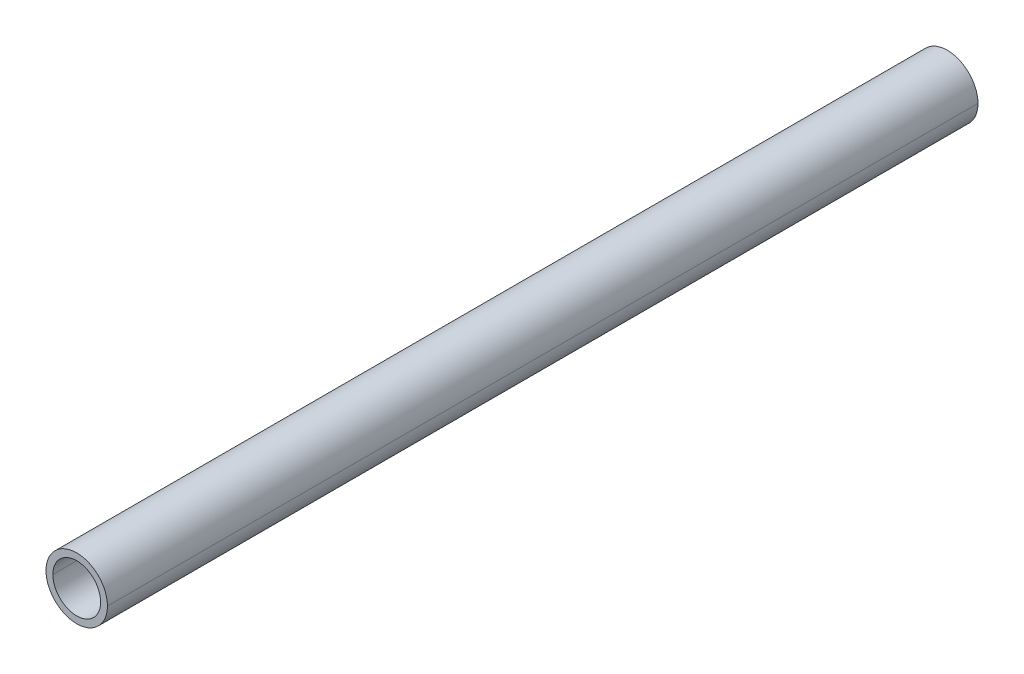
ISO-10303-21;
HEADER;
FILE_DESCRIPTION(('STEP AP214'),'2;1');
FILE_NAME('part.step','',(''),(''),'','','');
FILE_SCHEMA(('AUTOMOTIVE_DESIGN { 1 0 10303 214 1 1 1 1 }'));
ENDSEC;
DATA;
#1=APPLICATION_CONTEXT('core data for automotive mechanical design processes');
#2=APPLICATION_PROTOCOL_DEFINITION('international standard','automotive_design',2000,#1);
#3=PRODUCT_CONTEXT('',#1,'mechanical');
#4=PRODUCT('Part','Part','',(#3));
#5=PRODUCT_RELATED_PRODUCT_CATEGORY('part','',(#4));
#6=PRODUCT_DEFINITION_FORMATION('','',#4);
#7=PRODUCT_DEFINITION_CONTEXT('part definition',#1,'design');
#8=PRODUCT_DEFINITION('design','',#6,#7);
#9=PRODUCT_DEFINITION_SHAPE('','',#8);
#10=(LENGTH_UNIT() NAMED_UNIT(*) SI_UNIT(.MILLI.,.METRE.));
#11=(NAMED_UNIT(*) PLANE_ANGLE_UNIT() SI_UNIT($,.RADIAN.));
#12=(NAMED_UNIT(*) SI_UNIT($,.STERADIAN.) SOLID_ANGLE_UNIT());
#13=UNCERTAINTY_MEASURE_WITH_UNIT(LENGTH_MEASURE(1.E-05),#10,'distance_accuracy_value','');
#14=(GEOMETRIC_REPRESENTATION_CONTEXT(3) GLOBAL_UNCERTAINTY_ASSIGNED_CONTEXT((#13)) GLOBAL_UNIT_ASSIGNED_CONTEXT((#10,
#11,#12)) REPRESENTATION_CONTEXT('',''));
#15=CARTESIAN_POINT('',(0.,0.,0.));
#16=DIRECTION('',(0.,0.,1.));
#17=DIRECTION('',(1.,0.,0.));
#18=AXIS2_PLACEMENT_3D('',#15,#16,#17);
#19=CARTESIAN_POINT('',(0.,0.,255.08));
#20=DIRECTION('',(0.,0.,-1.));
#21=DIRECTION('',(-1.,0.,0.));
#22=AXIS2_PLACEMENT_3D('',#19,#20,#21);
#23=CYLINDRICAL_SURFACE('',#22,7.);
#24=DIRECTION('',(0.,0.,-1.));
#25=VECTOR('',#24,1.);
#26=CARTESIAN_POINT('',(7.,0.,255.08));
#27=LINE('',#26,#25);
#28=CARTESIAN_POINT('',(7.,0.,255.08));
#29=VERTEX_POINT('',#28);
#30=CARTESIAN_POINT('',(7.,0.,0.));
#31=VERTEX_POINT('',#30);
#32=EDGE_CURVE('E83',#29,#31,#27,.T.);
#33=ORIENTED_EDGE('',*,*,#32,.F.);
#34=CARTESIAN_POINT('',(0.,0.,255.08));
#35=DIRECTION('',(0.,0.,1.));
#36=DIRECTION('',(1.,0.,0.));
#37=AXIS2_PLACEMENT_3D('',#34,#35,#36);
#38=CIRCLE('',#37,7.);
#39=CARTESIAN_POINT('',(-7.,0.,255.08));
#40=VERTEX_POINT('',#39);
#41=EDGE_CURVE('E75',#29,#40,#38,.T.);
#42=ORIENTED_EDGE('',*,*,#41,.T.);
#43=DIRECTION('',(0.,0.,-1.));
#44=VECTOR('',#43,1.);
#45=CARTESIAN_POINT('',(-7.,0.,255.08));
#46=LINE('',#45,#44);
#47=CARTESIAN_POINT('',(-7.,0.,0.));
#48=VERTEX_POINT('',#47);
#49=EDGE_CURVE('E73',#40,#48,#46,.T.);
#50=ORIENTED_EDGE('',*,*,#49,.T.);
#51=CARTESIAN_POINT('',(0.,0.,0.));
#52=DIRECTION('',(0.,0.,1.));
#53=DIRECTION('',(1.,0.,0.));
#54=AXIS2_PLACEMENT_3D('',#51,#52,#53);
#55=CIRCLE('',#54,7.);
#56=EDGE_CURVE('E11',#31,#48,#55,.T.);
#57=ORIENTED_EDGE('',*,*,#56,.F.);
#58=EDGE_LOOP('',(#33,#42,#50,#57));
#59=FACE_BOUND('',#58,.T.);
#60=ADVANCED_FACE('F16',(#59),#23,.F.);
#61=CARTESIAN_POINT('',(0.,0.,255.08));
#62=DIRECTION('',(0.,0.,-1.));
#63=DIRECTION('',(-1.,0.,0.));
#64=AXIS2_PLACEMENT_3D('',#61,#62,#63);
#65=CYLINDRICAL_SURFACE('',#64,9.);
#66=DIRECTION('',(0.,0.,-1.));
#67=VECTOR('',#66,1.);
#68=CARTESIAN_POINT('',(9.,0.,255.08));
#69=LINE('',#68,#67);
#70=CARTESIAN_POINT('',(9.,0.,255.08));
#71=VERTEX_POINT('',#70);
#72=CARTESIAN_POINT('',(9.,0.,0.));
#73=VERTEX_POINT('',#72);
#74=EDGE_CURVE('E105',#71,#73,#69,.T.);
#75=ORIENTED_EDGE('',*,*,#74,.F.);
#76=CARTESIAN_POINT('',(0.,0.,255.08));
#77=DIRECTION('',(0.,0.,1.));
#78=DIRECTION('',(1.,0.,0.));
#79=AXIS2_PLACEMENT_3D('',#76,#77,#78);
#80=CIRCLE('',#79,9.);
#81=CARTESIAN_POINT('',(-9.,0.,255.08));
#82=VERTEX_POINT('',#81);
#83=EDGE_CURVE('E94',#82,#71,#80,.T.);
#84=ORIENTED_EDGE('',*,*,#83,.F.);
#85=DIRECTION('',(0.,0.,-1.));
#86=VECTOR('',#85,1.);
#87=CARTESIAN_POINT('',(-9.,0.,255.08));
#88=LINE('',#87,#86);
#89=CARTESIAN_POINT('',(-9.,0.,0.));
#90=VERTEX_POINT('',#89);
#91=EDGE_CURVE('E91',#82,#90,#88,.T.);
#92=ORIENTED_EDGE('',*,*,#91,.T.);
#93=CARTESIAN_POINT('',(0.,0.,0.));
#94=DIRECTION('',(0.,0.,1.));
#95=DIRECTION('',(1.,0.,0.));
#96=AXIS2_PLACEMENT_3D('',#93,#94,#95);
#97=CIRCLE('',#96,9.);
#98=EDGE_CURVE('E26',#90,#73,#97,.T.);
#99=ORIENTED_EDGE('',*,*,#98,.T.);
#100=EDGE_LOOP('',(#75,#84,#92,#99));
#101=FACE_BOUND('',#100,.T.);
#102=ADVANCED_FACE('F119',(#101),#65,.T.);
#103=CARTESIAN_POINT('',(0.,0.,0.));
#104=DIRECTION('',(0.,0.,1.));
#105=DIRECTION('',(1.,0.,0.));
#106=AXIS2_PLACEMENT_3D('',#103,#104,#105);
#107=PLANE('',#106);
#108=CARTESIAN_POINT('',(0.,0.,0.));
#109=DIRECTION('',(0.,0.,1.));
#110=DIRECTION('',(1.,0.,0.));
#111=AXIS2_PLACEMENT_3D('',#108,#109,#110);
#112=CIRCLE('',#111,7.);
#113=EDGE_CURVE('E68',#48,#31,#112,.T.);
#114=ORIENTED_EDGE('',*,*,#113,.T.);
#115=ORIENTED_EDGE('',*,*,#56,.T.);
#116=EDGE_LOOP('',(#114,#115));
#117=FACE_BOUND('',#116,.T.);
#118=ORIENTED_EDGE('',*,*,#98,.F.);
#119=CARTESIAN_POINT('',(0.,0.,0.));
#120=DIRECTION('',(0.,0.,1.));
#121=DIRECTION('',(1.,0.,0.));
#122=AXIS2_PLACEMENT_3D('',#119,#120,#121);
#123=CIRCLE('',#122,9.);
#124=EDGE_CURVE('E95',#73,#90,#123,.T.);
#125=ORIENTED_EDGE('',*,*,#124,.F.);
#126=EDGE_LOOP('',(#118,#125));
#127=FACE_BOUND('',#126,.T.);
#128=ADVANCED_FACE('F66',(#117,#127),#107,.F.);
#129=CARTESIAN_POINT('',(0.,0.,255.08));
#130=DIRECTION('',(0.,0.,1.));
#131=DIRECTION('',(1.,0.,0.));
#132=AXIS2_PLACEMENT_3D('',#129,#130,#131);
#133=PLANE('',#132);
#134=CARTESIAN_POINT('',(0.,0.,255.08));
#135=DIRECTION('',(0.,0.,1.));
#136=DIRECTION('',(1.,0.,0.));
#137=AXIS2_PLACEMENT_3D('',#134,#135,#136);
#138=CIRCLE('',#137,7.);
#139=EDGE_CURVE('E19',#40,#29,#138,.T.);
#140=ORIENTED_EDGE('',*,*,#139,.F.);
#141=ORIENTED_EDGE('',*,*,#41,.F.);
#142=EDGE_LOOP('',(#140,#141));
#143=FACE_BOUND('',#142,.T.);
#144=ORIENTED_EDGE('',*,*,#83,.T.);
#145=CARTESIAN_POINT('',(0.,0.,255.08));
#146=DIRECTION('',(0.,0.,1.));
#147=DIRECTION('',(1.,0.,0.));
#148=AXIS2_PLACEMENT_3D('',#145,#146,#147);
#149=CIRCLE('',#148,9.);
#150=EDGE_CURVE('E80',#71,#82,#149,.T.);
#151=ORIENTED_EDGE('',*,*,#150,.T.);
#152=EDGE_LOOP('',(#144,#151));
#153=FACE_BOUND('',#152,.T.);
#154=ADVANCED_FACE('F121',(#143,#153),#133,.T.);
#155=CARTESIAN_POINT('',(0.,0.,255.08));
#156=DIRECTION('',(0.,0.,-1.));
#157=DIRECTION('',(-1.,0.,0.));
#158=AXIS2_PLACEMENT_3D('',#155,#156,#157);
#159=CYLINDRICAL_SURFACE('',#158,9.);
#160=ORIENTED_EDGE('',*,*,#150,.F.);
#161=ORIENTED_EDGE('',*,*,#74,.T.);
#162=ORIENTED_EDGE('',*,*,#124,.T.);
#163=ORIENTED_EDGE('',*,*,#91,.F.);
#164=EDGE_LOOP('',(#160,#161,#162,#163));
#165=FACE_BOUND('',#164,.T.);
#166=ADVANCED_FACE('F116',(#165),#159,.T.);
#167=CARTESIAN_POINT('',(0.,0.,255.08));
#168=DIRECTION('',(0.,0.,-1.));
#169=DIRECTION('',(-1.,0.,0.));
#170=AXIS2_PLACEMENT_3D('',#167,#168,#169);
#171=CYLINDRICAL_SURFACE('',#170,7.);
#172=ORIENTED_EDGE('',*,*,#139,.T.);
#173=ORIENTED_EDGE('',*,*,#32,.T.);
#174=ORIENTED_EDGE('',*,*,#113,.F.);
#175=ORIENTED_EDGE('',*,*,#49,.F.);
#176=EDGE_LOOP('',(#172,#173,#174,#175));
#177=FACE_BOUND('',#176,.T.);
#178=ADVANCED_FACE('F82',(#177),#171,.F.);
#179=CLOSED_SHELL('',(#60,#102,#128,#154,#166,#178));
#180=MANIFOLD_SOLID_BREP('B1',#179);
#181=ADVANCED_BREP_SHAPE_REPRESENTATION('',(#18,#180),#14);
#182=SHAPE_DEFINITION_REPRESENTATION(#9,#181);
ENDSEC;
END-ISO-10303-21;
